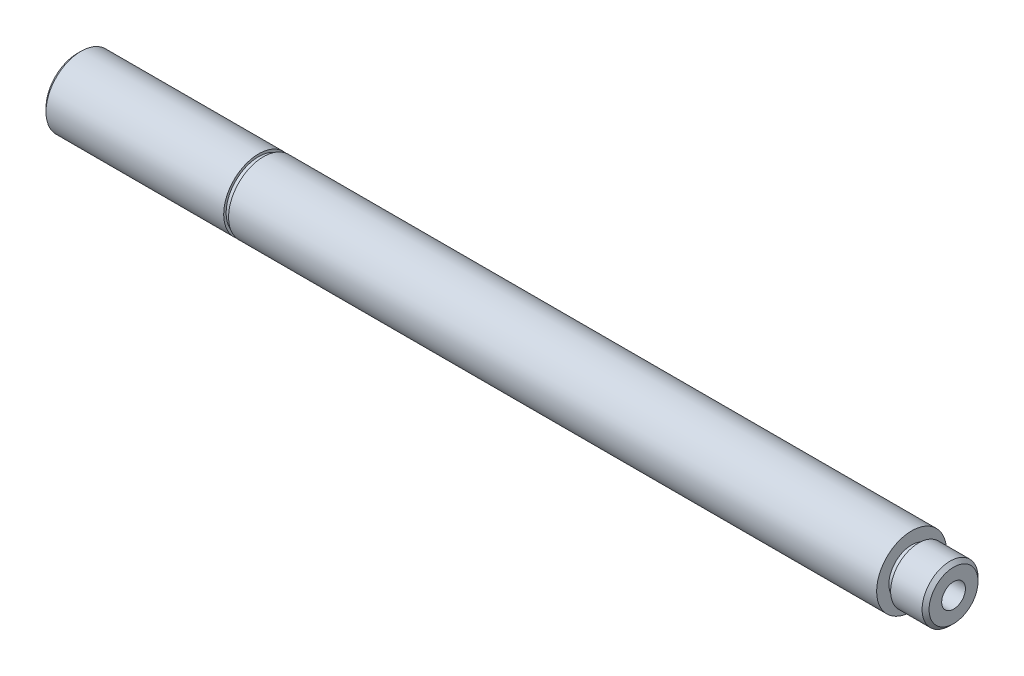
ISO-10303-21;
HEADER;
FILE_DESCRIPTION(('STEP AP214'),'2;1');
FILE_NAME('part.step','',(''),(''),'','','');
FILE_SCHEMA(('AUTOMOTIVE_DESIGN { 1 0 10303 214 1 1 1 1 }'));
ENDSEC;
DATA;
#1=APPLICATION_CONTEXT('core data for automotive mechanical design processes');
#2=APPLICATION_PROTOCOL_DEFINITION('international standard','automotive_design',2000,#1);
#3=PRODUCT_CONTEXT('',#1,'mechanical');
#4=PRODUCT('Part','Part','',(#3));
#5=PRODUCT_RELATED_PRODUCT_CATEGORY('part','',(#4));
#6=PRODUCT_DEFINITION_FORMATION('','',#4);
#7=PRODUCT_DEFINITION_CONTEXT('part definition',#1,'design');
#8=PRODUCT_DEFINITION('design','',#6,#7);
#9=PRODUCT_DEFINITION_SHAPE('','',#8);
#10=(LENGTH_UNIT() NAMED_UNIT(*) SI_UNIT(.MILLI.,.METRE.));
#11=(NAMED_UNIT(*) PLANE_ANGLE_UNIT() SI_UNIT($,.RADIAN.));
#12=(NAMED_UNIT(*) SI_UNIT($,.STERADIAN.) SOLID_ANGLE_UNIT());
#13=UNCERTAINTY_MEASURE_WITH_UNIT(LENGTH_MEASURE(1.E-05),#10,'distance_accuracy_value','');
#14=(GEOMETRIC_REPRESENTATION_CONTEXT(3) GLOBAL_UNCERTAINTY_ASSIGNED_CONTEXT((#13)) GLOBAL_UNIT_ASSIGNED_CONTEXT((#10,
#11,#12)) REPRESENTATION_CONTEXT('',''));
#15=CARTESIAN_POINT('',(0.,0.,0.));
#16=DIRECTION('',(0.,0.,1.));
#17=DIRECTION('',(1.,0.,0.));
#18=AXIS2_PLACEMENT_3D('',#15,#16,#17);
#19=CARTESIAN_POINT('',(-123.335902370818,0.,0.));
#20=DIRECTION('',(-1.,0.,0.));
#21=DIRECTION('',(0.,0.,1.));
#22=AXIS2_PLACEMENT_3D('',#19,#20,#21);
#23=CYLINDRICAL_SURFACE('',#22,10.);
#24=CARTESIAN_POINT('',(238.5,0.,0.));
#25=DIRECTION('',(-1.,0.,0.));
#26=DIRECTION('',(0.,0.,1.));
#27=AXIS2_PLACEMENT_3D('',#24,#25,#26);
#28=CIRCLE('',#27,10.);
#29=CARTESIAN_POINT('',(238.5,0.,10.));
#30=VERTEX_POINT('',#29);
#31=EDGE_CURVE('E94',#30,#30,#28,.T.);
#32=ORIENTED_EDGE('',*,*,#31,.T.);
#33=EDGE_LOOP('',(#32));
#34=FACE_BOUND('',#33,.T.);
#35=CARTESIAN_POINT('',(53.2,0.,0.));
#36=DIRECTION('',(-1.,0.,0.));
#37=DIRECTION('',(0.,0.,1.));
#38=AXIS2_PLACEMENT_3D('',#35,#36,#37);
#39=CIRCLE('',#38,10.);
#40=CARTESIAN_POINT('',(53.2,0.,10.));
#41=VERTEX_POINT('',#40);
#42=EDGE_CURVE('E145',#41,#41,#39,.T.);
#43=ORIENTED_EDGE('',*,*,#42,.F.);
#44=EDGE_LOOP('',(#43));
#45=FACE_BOUND('',#44,.T.);
#46=ADVANCED_FACE('F53',(#34,#45),#23,.T.);
#47=CARTESIAN_POINT('',(238.5,10.,0.));
#48=DIRECTION('',(-1.,0.,0.));
#49=DIRECTION('',(0.,0.,1.));
#50=AXIS2_PLACEMENT_3D('',#47,#48,#49);
#51=PLANE('',#50);
#52=ORIENTED_EDGE('',*,*,#31,.F.);
#53=EDGE_LOOP('',(#52));
#54=FACE_BOUND('',#53,.T.);
#55=CARTESIAN_POINT('',(238.5,0.,0.));
#56=DIRECTION('',(-1.,0.,0.));
#57=DIRECTION('',(0.,0.,1.));
#58=AXIS2_PLACEMENT_3D('',#55,#56,#57);
#59=CIRCLE('',#58,6.5);
#60=CARTESIAN_POINT('',(238.5,0.,6.5));
#61=VERTEX_POINT('',#60);
#62=EDGE_CURVE('E85',#61,#61,#59,.T.);
#63=ORIENTED_EDGE('',*,*,#62,.T.);
#64=EDGE_LOOP('',(#63));
#65=FACE_BOUND('',#64,.T.);
#66=ADVANCED_FACE('F118',(#54,#65),#51,.F.);
#67=CARTESIAN_POINT('',(0.,0.,0.));
#68=DIRECTION('',(-1.,0.,0.));
#69=DIRECTION('',(0.,0.,1.));
#70=AXIS2_PLACEMENT_3D('',#67,#68,#69);
#71=CYLINDRICAL_SURFACE('',#70,6.5);
#72=CARTESIAN_POINT('',(240.5,0.,0.));
#73=DIRECTION('',(-1.,0.,0.));
#74=DIRECTION('',(0.,0.,1.));
#75=AXIS2_PLACEMENT_3D('',#72,#73,#74);
#76=CIRCLE('',#75,6.5);
#77=CARTESIAN_POINT('',(240.5,0.,6.5));
#78=VERTEX_POINT('',#77);
#79=EDGE_CURVE('E159',#78,#78,#76,.T.);
#80=ORIENTED_EDGE('',*,*,#79,.T.);
#81=EDGE_LOOP('',(#80));
#82=FACE_BOUND('',#81,.T.);
#83=ORIENTED_EDGE('',*,*,#62,.F.);
#84=EDGE_LOOP('',(#83));
#85=FACE_BOUND('',#84,.T.);
#86=ADVANCED_FACE('F126',(#82,#85),#71,.T.);
#87=CARTESIAN_POINT('',(240.5,8.,0.));
#88=DIRECTION('',(-1.,0.,0.));
#89=DIRECTION('',(0.,0.,1.));
#90=AXIS2_PLACEMENT_3D('',#87,#88,#89);
#91=PLANE('',#90);
#92=CARTESIAN_POINT('',(240.5,0.,0.));
#93=DIRECTION('',(-1.,0.,0.));
#94=DIRECTION('',(0.,0.,1.));
#95=AXIS2_PLACEMENT_3D('',#92,#93,#94);
#96=CIRCLE('',#95,8.);
#97=CARTESIAN_POINT('',(240.5,0.,8.));
#98=VERTEX_POINT('',#97);
#99=EDGE_CURVE('E156',#98,#98,#96,.T.);
#100=ORIENTED_EDGE('',*,*,#99,.T.);
#101=EDGE_LOOP('',(#100));
#102=FACE_BOUND('',#101,.T.);
#103=ORIENTED_EDGE('',*,*,#79,.F.);
#104=EDGE_LOOP('',(#103));
#105=FACE_BOUND('',#104,.T.);
#106=ADVANCED_FACE('F72',(#102,#105),#91,.T.);
#107=CARTESIAN_POINT('',(230.5,0.,0.));
#108=DIRECTION('',(1.,0.,0.));
#109=DIRECTION('',(0.,0.,-1.));
#110=AXIS2_PLACEMENT_3D('',#107,#108,#109);
#111=CONICAL_SURFACE('',#110,3.4,1.02974425867665);
#112=CARTESIAN_POINT('',(228.457073895306,0.,0.));
#113=VERTEX_POINT('',#112);
#114=VERTEX_LOOP('',#113);
#115=FACE_BOUND('',#114,.T.);
#116=CARTESIAN_POINT('',(230.5,0.,0.));
#117=DIRECTION('',(1.,0.,0.));
#118=DIRECTION('',(0.,0.,-1.));
#119=AXIS2_PLACEMENT_3D('',#116,#117,#118);
#120=CIRCLE('',#119,3.4);
#121=CARTESIAN_POINT('',(230.5,0.,-3.4));
#122=VERTEX_POINT('',#121);
#123=EDGE_CURVE('E76',#122,#122,#120,.T.);
#124=ORIENTED_EDGE('',*,*,#123,.T.);
#125=EDGE_LOOP('',(#124));
#126=FACE_BOUND('',#125,.T.);
#127=ADVANCED_FACE('F68',(#115,#126),#111,.F.);
#128=CARTESIAN_POINT('',(250.5,0.,0.));
#129=DIRECTION('',(1.,0.,0.));
#130=DIRECTION('',(0.,0.,-1.));
#131=AXIS2_PLACEMENT_3D('',#128,#129,#130);
#132=CYLINDRICAL_SURFACE('',#131,3.4);
#133=ORIENTED_EDGE('',*,*,#123,.F.);
#134=EDGE_LOOP('',(#133));
#135=FACE_BOUND('',#134,.T.);
#136=CARTESIAN_POINT('',(250.5,0.,0.));
#137=DIRECTION('',(1.,0.,0.));
#138=DIRECTION('',(0.,0.,-1.));
#139=AXIS2_PLACEMENT_3D('',#136,#137,#138);
#140=CIRCLE('',#139,3.4);
#141=CARTESIAN_POINT('',(250.5,0.,-3.4));
#142=VERTEX_POINT('',#141);
#143=EDGE_CURVE('E79',#142,#142,#140,.T.);
#144=ORIENTED_EDGE('',*,*,#143,.T.);
#145=EDGE_LOOP('',(#144));
#146=FACE_BOUND('',#145,.T.);
#147=ADVANCED_FACE('F71',(#135,#146),#132,.F.);
#148=CARTESIAN_POINT('',(250.5,8.,0.));
#149=DIRECTION('',(-1.,0.,0.));
#150=DIRECTION('',(0.,0.,1.));
#151=AXIS2_PLACEMENT_3D('',#148,#149,#150);
#152=PLANE('',#151);
#153=CARTESIAN_POINT('',(250.5,0.,0.));
#154=DIRECTION('',(-1.,0.,0.));
#155=DIRECTION('',(0.,0.,1.));
#156=AXIS2_PLACEMENT_3D('',#153,#154,#155);
#157=CIRCLE('',#156,6.99999999999998);
#158=CARTESIAN_POINT('',(250.5,0.,6.99999999999998));
#159=VERTEX_POINT('',#158);
#160=EDGE_CURVE('E11',#159,#159,#157,.F.);
#161=ORIENTED_EDGE('',*,*,#160,.T.);
#162=EDGE_LOOP('',(#161));
#163=FACE_BOUND('',#162,.T.);
#164=ORIENTED_EDGE('',*,*,#143,.F.);
#165=EDGE_LOOP('',(#164));
#166=FACE_BOUND('',#165,.T.);
#167=ADVANCED_FACE('F175',(#163,#166),#152,.F.);
#168=CARTESIAN_POINT('',(-123.335902370818,0.,0.));
#169=DIRECTION('',(-1.,0.,0.));
#170=DIRECTION('',(0.,0.,1.));
#171=AXIS2_PLACEMENT_3D('',#168,#169,#170);
#172=CYLINDRICAL_SURFACE('',#171,8.);
#173=CARTESIAN_POINT('',(249.5,0.,0.));
#174=DIRECTION('',(-1.,0.,0.));
#175=DIRECTION('',(0.,0.,1.));
#176=AXIS2_PLACEMENT_3D('',#173,#174,#175);
#177=CIRCLE('',#176,8.);
#178=CARTESIAN_POINT('',(249.5,0.,8.));
#179=VERTEX_POINT('',#178);
#180=EDGE_CURVE('E62',#179,#179,#177,.T.);
#181=ORIENTED_EDGE('',*,*,#180,.T.);
#182=EDGE_LOOP('',(#181));
#183=FACE_BOUND('',#182,.T.);
#184=ORIENTED_EDGE('',*,*,#99,.F.);
#185=EDGE_LOOP('',(#184));
#186=FACE_BOUND('',#185,.T.);
#187=ADVANCED_FACE('F105',(#183,#186),#172,.T.);
#188=CARTESIAN_POINT('',(51.8,10.,0.));
#189=DIRECTION('',(1.,0.,0.));
#190=DIRECTION('',(0.,0.,-1.));
#191=AXIS2_PLACEMENT_3D('',#188,#189,#190);
#192=PLANE('',#191);
#193=CARTESIAN_POINT('',(51.8,0.,0.));
#194=DIRECTION('',(-1.,0.,0.));
#195=DIRECTION('',(0.,0.,1.));
#196=AXIS2_PLACEMENT_3D('',#193,#194,#195);
#197=CIRCLE('',#196,9.3);
#198=CARTESIAN_POINT('',(51.8,0.,9.3));
#199=VERTEX_POINT('',#198);
#200=EDGE_CURVE('E153',#199,#199,#197,.T.);
#201=ORIENTED_EDGE('',*,*,#200,.T.);
#202=EDGE_LOOP('',(#201));
#203=FACE_BOUND('',#202,.T.);
#204=CARTESIAN_POINT('',(51.8,0.,0.));
#205=DIRECTION('',(-1.,0.,0.));
#206=DIRECTION('',(0.,0.,1.));
#207=AXIS2_PLACEMENT_3D('',#204,#205,#206);
#208=CIRCLE('',#207,10.);
#209=CARTESIAN_POINT('',(51.8,0.,10.));
#210=VERTEX_POINT('',#209);
#211=EDGE_CURVE('E143',#210,#210,#208,.T.);
#212=ORIENTED_EDGE('',*,*,#211,.F.);
#213=EDGE_LOOP('',(#212));
#214=FACE_BOUND('',#213,.T.);
#215=ADVANCED_FACE('F192',(#203,#214),#192,.T.);
#216=CARTESIAN_POINT('',(0.,0.,0.));
#217=DIRECTION('',(-1.,0.,0.));
#218=DIRECTION('',(0.,0.,1.));
#219=AXIS2_PLACEMENT_3D('',#216,#217,#218);
#220=CYLINDRICAL_SURFACE('',#219,9.3);
#221=CARTESIAN_POINT('',(53.2,0.,0.));
#222=DIRECTION('',(-1.,0.,0.));
#223=DIRECTION('',(0.,0.,1.));
#224=AXIS2_PLACEMENT_3D('',#221,#222,#223);
#225=CIRCLE('',#224,9.3);
#226=CARTESIAN_POINT('',(53.2,0.,9.3));
#227=VERTEX_POINT('',#226);
#228=EDGE_CURVE('E148',#227,#227,#225,.T.);
#229=ORIENTED_EDGE('',*,*,#228,.T.);
#230=EDGE_LOOP('',(#229));
#231=FACE_BOUND('',#230,.T.);
#232=ORIENTED_EDGE('',*,*,#200,.F.);
#233=EDGE_LOOP('',(#232));
#234=FACE_BOUND('',#233,.T.);
#235=ADVANCED_FACE('F195',(#231,#234),#220,.T.);
#236=CARTESIAN_POINT('',(53.2,10.,0.));
#237=DIRECTION('',(-1.,0.,0.));
#238=DIRECTION('',(0.,0.,1.));
#239=AXIS2_PLACEMENT_3D('',#236,#237,#238);
#240=PLANE('',#239);
#241=ORIENTED_EDGE('',*,*,#42,.T.);
#242=EDGE_LOOP('',(#241));
#243=FACE_BOUND('',#242,.T.);
#244=ORIENTED_EDGE('',*,*,#228,.F.);
#245=EDGE_LOOP('',(#244));
#246=FACE_BOUND('',#245,.T.);
#247=ADVANCED_FACE('F187',(#243,#246),#240,.T.);
#248=CARTESIAN_POINT('',(37.5,0.,0.));
#249=DIRECTION('',(-1.,0.,0.));
#250=DIRECTION('',(0.,0.,1.));
#251=AXIS2_PLACEMENT_3D('',#248,#249,#250);
#252=CONICAL_SURFACE('',#251,4.24999999999999,1.02974425867665);
#253=CARTESIAN_POINT('',(40.0536576308671,0.,0.));
#254=VERTEX_POINT('',#253);
#255=VERTEX_LOOP('',#254);
#256=FACE_BOUND('',#255,.T.);
#257=CARTESIAN_POINT('',(37.5,0.,0.));
#258=DIRECTION('',(-1.,0.,0.));
#259=DIRECTION('',(0.,0.,1.));
#260=AXIS2_PLACEMENT_3D('',#257,#258,#259);
#261=CIRCLE('',#260,4.24999999999999);
#262=CARTESIAN_POINT('',(37.5,0.,4.24999999999999));
#263=VERTEX_POINT('',#262);
#264=EDGE_CURVE('E91',#263,#263,#261,.T.);
#265=ORIENTED_EDGE('',*,*,#264,.T.);
#266=EDGE_LOOP('',(#265));
#267=FACE_BOUND('',#266,.T.);
#268=ADVANCED_FACE('F183',(#256,#267),#252,.F.);
#269=CARTESIAN_POINT('',(0.,0.,0.));
#270=DIRECTION('',(-1.,0.,0.));
#271=DIRECTION('',(0.,0.,1.));
#272=AXIS2_PLACEMENT_3D('',#269,#270,#271);
#273=CYLINDRICAL_SURFACE('',#272,4.24999999999999);
#274=ORIENTED_EDGE('',*,*,#264,.F.);
#275=EDGE_LOOP('',(#274));
#276=FACE_BOUND('',#275,.T.);
#277=CARTESIAN_POINT('',(1.25000000000002,0.,0.));
#278=DIRECTION('',(-1.,0.,0.));
#279=DIRECTION('',(0.,0.,1.));
#280=AXIS2_PLACEMENT_3D('',#277,#278,#279);
#281=CIRCLE('',#280,4.24999999999999);
#282=CARTESIAN_POINT('',(1.25000000000002,0.,4.24999999999999));
#283=VERTEX_POINT('',#282);
#284=EDGE_CURVE('E82',#283,#283,#281,.T.);
#285=ORIENTED_EDGE('',*,*,#284,.T.);
#286=EDGE_LOOP('',(#285));
#287=FACE_BOUND('',#286,.T.);
#288=ADVANCED_FACE('F179',(#276,#287),#273,.F.);
#289=CARTESIAN_POINT('',(0.,0.,0.));
#290=DIRECTION('',(-1.,0.,0.));
#291=DIRECTION('',(0.,0.,1.));
#292=AXIS2_PLACEMENT_3D('',#289,#290,#291);
#293=CONICAL_SURFACE('',#292,5.5,0.785398163397447);
#294=ORIENTED_EDGE('',*,*,#284,.F.);
#295=EDGE_LOOP('',(#294));
#296=FACE_BOUND('',#295,.T.);
#297=CARTESIAN_POINT('',(0.,0.,0.));
#298=DIRECTION('',(-1.,0.,0.));
#299=DIRECTION('',(0.,0.,1.));
#300=AXIS2_PLACEMENT_3D('',#297,#298,#299);
#301=CIRCLE('',#300,5.5);
#302=CARTESIAN_POINT('',(0.,0.,5.5));
#303=VERTEX_POINT('',#302);
#304=EDGE_CURVE('E78',#303,#303,#301,.T.);
#305=ORIENTED_EDGE('',*,*,#304,.T.);
#306=EDGE_LOOP('',(#305));
#307=FACE_BOUND('',#306,.T.);
#308=ADVANCED_FACE('F137',(#296,#307),#293,.F.);
#309=CARTESIAN_POINT('',(0.,0.,0.));
#310=DIRECTION('',(1.,0.,0.));
#311=DIRECTION('',(0.,0.,-1.));
#312=AXIS2_PLACEMENT_3D('',#309,#310,#311);
#313=PLANE('',#312);
#314=CARTESIAN_POINT('',(0.,0.,0.));
#315=DIRECTION('',(1.,0.,0.));
#316=DIRECTION('',(0.,0.,-1.));
#317=AXIS2_PLACEMENT_3D('',#314,#315,#316);
#318=CIRCLE('',#317,8.99999999999998);
#319=CARTESIAN_POINT('',(0.,0.,-8.99999999999998));
#320=VERTEX_POINT('',#319);
#321=EDGE_CURVE('E97',#320,#320,#318,.F.);
#322=ORIENTED_EDGE('',*,*,#321,.T.);
#323=EDGE_LOOP('',(#322));
#324=FACE_BOUND('',#323,.T.);
#325=ORIENTED_EDGE('',*,*,#304,.F.);
#326=EDGE_LOOP('',(#325));
#327=FACE_BOUND('',#326,.T.);
#328=ADVANCED_FACE('F132',(#324,#327),#313,.F.);
#329=CARTESIAN_POINT('',(1.,0.,0.));
#330=DIRECTION('',(1.,0.,0.));
#331=DIRECTION('',(0.,0.,-1.));
#332=AXIS2_PLACEMENT_3D('',#329,#330,#331);
#333=CIRCLE('',#332,10.);
#334=CARTESIAN_POINT('',(1.,0.,-10.));
#335=VERTEX_POINT('',#334);
#336=EDGE_CURVE('E100',#335,#335,#333,.T.);
#337=ORIENTED_EDGE('',*,*,#336,.T.);
#338=EDGE_LOOP('',(#337));
#339=FACE_BOUND('',#338,.T.);
#340=ORIENTED_EDGE('',*,*,#211,.T.);
#341=EDGE_LOOP('',(#340));
#342=FACE_BOUND('',#341,.T.);
#343=ADVANCED_FACE('F114',(#339,#342),#23,.T.);
#344=CARTESIAN_POINT('',(0.,0.,0.));
#345=DIRECTION('',(1.,0.,0.));
#346=DIRECTION('',(0.,0.,-1.));
#347=AXIS2_PLACEMENT_3D('',#344,#345,#346);
#348=CONICAL_SURFACE('',#347,8.99999999999998,0.785398163397458);
#349=ORIENTED_EDGE('',*,*,#336,.F.);
#350=EDGE_LOOP('',(#349));
#351=FACE_BOUND('',#350,.T.);
#352=ORIENTED_EDGE('',*,*,#321,.F.);
#353=EDGE_LOOP('',(#352));
#354=FACE_BOUND('',#353,.T.);
#355=ADVANCED_FACE('F109',(#351,#354),#348,.T.);
#356=CARTESIAN_POINT('',(249.5,0.,0.));
#357=DIRECTION('',(-1.,0.,0.));
#358=DIRECTION('',(0.,0.,1.));
#359=AXIS2_PLACEMENT_3D('',#356,#357,#358);
#360=CONICAL_SURFACE('',#359,8.,0.785398163397459);
#361=ORIENTED_EDGE('',*,*,#160,.F.);
#362=EDGE_LOOP('',(#361));
#363=FACE_BOUND('',#362,.T.);
#364=ORIENTED_EDGE('',*,*,#180,.F.);
#365=EDGE_LOOP('',(#364));
#366=FACE_BOUND('',#365,.T.);
#367=ADVANCED_FACE('F56',(#363,#366),#360,.T.);
#368=CLOSED_SHELL('',(#46,#66,#86,#106,#127,#147,#167,#187,#215,#235,#247,#268,#288,#308,#328,
#343,#355,#367));
#369=MANIFOLD_SOLID_BREP('B2',#368);
#370=ADVANCED_BREP_SHAPE_REPRESENTATION('',(#18,#369),#14);
#371=SHAPE_DEFINITION_REPRESENTATION(#9,#370);
ENDSEC;
END-ISO-10303-21;
